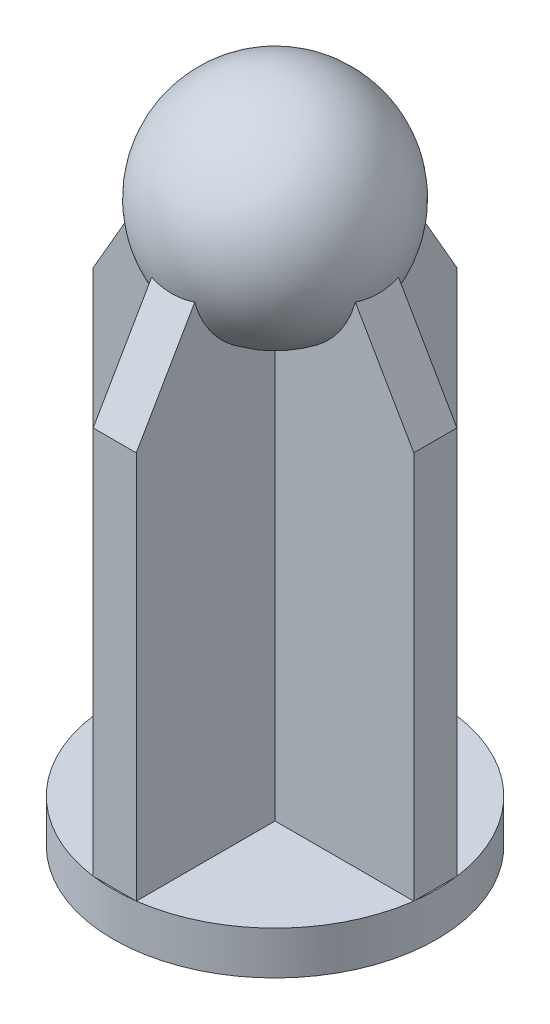
ISO-10303-21;
HEADER;
FILE_DESCRIPTION(('STEP AP214'),'2;1');
FILE_NAME('part.step','',(''),(''),'','','');
FILE_SCHEMA(('AUTOMOTIVE_DESIGN { 1 0 10303 214 1 1 1 1 }'));
ENDSEC;
DATA;
#1=APPLICATION_CONTEXT('core data for automotive mechanical design processes');
#2=APPLICATION_PROTOCOL_DEFINITION('international standard','automotive_design',2000,#1);
#3=PRODUCT_CONTEXT('',#1,'mechanical');
#4=PRODUCT('Part','Part','',(#3));
#5=PRODUCT_RELATED_PRODUCT_CATEGORY('part','',(#4));
#6=PRODUCT_DEFINITION_FORMATION('','',#4);
#7=PRODUCT_DEFINITION_CONTEXT('part definition',#1,'design');
#8=PRODUCT_DEFINITION('design','',#6,#7);
#9=PRODUCT_DEFINITION_SHAPE('','',#8);
#10=(LENGTH_UNIT() NAMED_UNIT(*) SI_UNIT(.MILLI.,.METRE.));
#11=(NAMED_UNIT(*) PLANE_ANGLE_UNIT() SI_UNIT($,.RADIAN.));
#12=(NAMED_UNIT(*) SI_UNIT($,.STERADIAN.) SOLID_ANGLE_UNIT());
#13=UNCERTAINTY_MEASURE_WITH_UNIT(LENGTH_MEASURE(1.E-05),#10,'distance_accuracy_value','');
#14=(GEOMETRIC_REPRESENTATION_CONTEXT(3) GLOBAL_UNCERTAINTY_ASSIGNED_CONTEXT((#13)) GLOBAL_UNIT_ASSIGNED_CONTEXT((#10,
#11,#12)) REPRESENTATION_CONTEXT('',''));
#15=CARTESIAN_POINT('',(0.,0.,0.));
#16=DIRECTION('',(0.,0.,1.));
#17=DIRECTION('',(1.,0.,0.));
#18=AXIS2_PLACEMENT_3D('',#15,#16,#17);
#19=CARTESIAN_POINT('',(0.,10.,0.));
#20=DIRECTION('',(0.,1.,0.));
#21=DIRECTION('',(0.,0.,1.));
#22=AXIS2_PLACEMENT_3D('',#19,#20,#21);
#23=PLANE('',#22);
#24=DIRECTION('',(-1.,0.,0.));
#25=VECTOR('',#24,1.);
#26=CARTESIAN_POINT('',(-5.,10.,-4.99999999999999));
#27=LINE('',#26,#25);
#28=CARTESIAN_POINT('',(-5.,10.,-4.99999999999999));
#29=VERTEX_POINT('',#28);
#30=CARTESIAN_POINT('',(-37.1651718682963,10.,-4.99999999999996));
#31=VERTEX_POINT('',#30);
#32=EDGE_CURVE('E247',#29,#31,#27,.T.);
#33=ORIENTED_EDGE('',*,*,#32,.F.);
#34=DIRECTION('',(0.,0.,1.));
#35=VECTOR('',#34,1.);
#36=CARTESIAN_POINT('',(-5.,10.,-4.99999999999999));
#37=LINE('',#36,#35);
#38=CARTESIAN_POINT('',(-5.00000000000003,10.,-37.1651718682962));
#39=VERTEX_POINT('',#38);
#40=EDGE_CURVE('E286',#39,#29,#37,.T.);
#41=ORIENTED_EDGE('',*,*,#40,.F.);
#42=CARTESIAN_POINT('',(0.,10.,0.));
#43=DIRECTION('',(0.,1.,0.));
#44=DIRECTION('',(0.,0.,1.));
#45=AXIS2_PLACEMENT_3D('',#42,#43,#44);
#46=CIRCLE('',#45,37.5);
#47=EDGE_CURVE('E341',#39,#31,#46,.T.);
#48=ORIENTED_EDGE('',*,*,#47,.T.);
#49=EDGE_LOOP('',(#33,#41,#48));
#50=FACE_BOUND('',#49,.T.);
#51=ADVANCED_FACE('F35',(#50),#23,.T.);
#52=DIRECTION('',(-1.,0.,0.));
#53=VECTOR('',#52,1.);
#54=CARTESIAN_POINT('',(-5.,10.,-37.1651718682962));
#55=LINE('',#54,#53);
#56=CARTESIAN_POINT('',(5.,10.,-37.1651718682962));
#57=VERTEX_POINT('',#56);
#58=EDGE_CURVE('E283',#57,#39,#55,.T.);
#59=ORIENTED_EDGE('',*,*,#58,.F.);
#60=EDGE_CURVE('E318',#57,#39,#46,.T.);
#61=ORIENTED_EDGE('',*,*,#60,.T.);
#62=EDGE_LOOP('',(#59,#61));
#63=FACE_BOUND('',#62,.T.);
#64=ADVANCED_FACE('F346',(#63),#23,.T.);
#65=DIRECTION('',(0.,0.,-1.));
#66=VECTOR('',#65,1.);
#67=CARTESIAN_POINT('',(5.00000000000001,10.,-5.00000000000002));
#68=LINE('',#67,#66);
#69=CARTESIAN_POINT('',(5.00000000000001,10.,-5.00000000000002));
#70=VERTEX_POINT('',#69);
#71=EDGE_CURVE('E280',#70,#57,#68,.T.);
#72=ORIENTED_EDGE('',*,*,#71,.F.);
#73=DIRECTION('',(-1.,0.,0.));
#74=VECTOR('',#73,1.);
#75=CARTESIAN_POINT('',(5.00000000000001,10.,-5.00000000000002));
#76=LINE('',#75,#74);
#77=CARTESIAN_POINT('',(37.1651718682963,10.,-4.99999999999996));
#78=VERTEX_POINT('',#77);
#79=EDGE_CURVE('E277',#78,#70,#76,.T.);
#80=ORIENTED_EDGE('',*,*,#79,.F.);
#81=EDGE_CURVE('E308',#78,#57,#46,.T.);
#82=ORIENTED_EDGE('',*,*,#81,.T.);
#83=EDGE_LOOP('',(#72,#80,#82));
#84=FACE_BOUND('',#83,.T.);
#85=ADVANCED_FACE('F307',(#84),#23,.T.);
#86=DIRECTION('',(0.,0.,-1.));
#87=VECTOR('',#86,1.);
#88=CARTESIAN_POINT('',(37.1651718682963,10.,-5.));
#89=LINE('',#88,#87);
#90=CARTESIAN_POINT('',(37.1651718682962,10.,5.));
#91=VERTEX_POINT('',#90);
#92=EDGE_CURVE('E274',#91,#78,#89,.T.);
#93=ORIENTED_EDGE('',*,*,#92,.F.);
#94=EDGE_CURVE('E202',#91,#78,#46,.T.);
#95=ORIENTED_EDGE('',*,*,#94,.T.);
#96=EDGE_LOOP('',(#93,#95));
#97=FACE_BOUND('',#96,.T.);
#98=ADVANCED_FACE('F321',(#97),#23,.T.);
#99=DIRECTION('',(1.,0.,0.));
#100=VECTOR('',#99,1.);
#101=CARTESIAN_POINT('',(5.00000000000001,10.,5.00000000000002));
#102=LINE('',#101,#100);
#103=CARTESIAN_POINT('',(5.00000000000001,10.,5.00000000000002));
#104=VERTEX_POINT('',#103);
#105=EDGE_CURVE('E272',#104,#91,#102,.T.);
#106=ORIENTED_EDGE('',*,*,#105,.F.);
#107=DIRECTION('',(0.,0.,-1.));
#108=VECTOR('',#107,1.);
#109=CARTESIAN_POINT('',(5.00000000000001,10.,5.00000000000002));
#110=LINE('',#109,#108);
#111=CARTESIAN_POINT('',(5.00000000000003,10.,37.1651718682962));
#112=VERTEX_POINT('',#111);
#113=EDGE_CURVE('E180',#112,#104,#110,.T.);
#114=ORIENTED_EDGE('',*,*,#113,.F.);
#115=EDGE_CURVE('E198',#112,#91,#46,.T.);
#116=ORIENTED_EDGE('',*,*,#115,.T.);
#117=EDGE_LOOP('',(#106,#114,#116));
#118=FACE_BOUND('',#117,.T.);
#119=ADVANCED_FACE('F324',(#118),#23,.T.);
#120=DIRECTION('',(1.,0.,0.));
#121=VECTOR('',#120,1.);
#122=CARTESIAN_POINT('',(-4.99999999999999,10.,37.1651718682962));
#123=LINE('',#122,#121);
#124=CARTESIAN_POINT('',(-4.99999999999999,10.,37.1651718682963));
#125=VERTEX_POINT('',#124);
#126=EDGE_CURVE('E268',#125,#112,#123,.T.);
#127=ORIENTED_EDGE('',*,*,#126,.F.);
#128=EDGE_CURVE('E203',#125,#112,#46,.T.);
#129=ORIENTED_EDGE('',*,*,#128,.T.);
#130=EDGE_LOOP('',(#127,#129));
#131=FACE_BOUND('',#130,.T.);
#132=ADVANCED_FACE('F334',(#131),#23,.T.);
#133=DIRECTION('',(0.,0.,1.));
#134=VECTOR('',#133,1.);
#135=CARTESIAN_POINT('',(-4.99999999999999,10.,4.99999999999999));
#136=LINE('',#135,#134);
#137=CARTESIAN_POINT('',(-4.99999999999999,10.,4.99999999999999));
#138=VERTEX_POINT('',#137);
#139=EDGE_CURVE('E265',#138,#125,#136,.T.);
#140=ORIENTED_EDGE('',*,*,#139,.F.);
#141=DIRECTION('',(1.,0.,0.));
#142=VECTOR('',#141,1.);
#143=CARTESIAN_POINT('',(-4.99999999999999,10.,4.99999999999999));
#144=LINE('',#143,#142);
#145=CARTESIAN_POINT('',(-37.1651718682963,10.,5.));
#146=VERTEX_POINT('',#145);
#147=EDGE_CURVE('E257',#146,#138,#144,.T.);
#148=ORIENTED_EDGE('',*,*,#147,.F.);
#149=EDGE_CURVE('E335',#146,#125,#46,.T.);
#150=ORIENTED_EDGE('',*,*,#149,.T.);
#151=EDGE_LOOP('',(#140,#148,#150));
#152=FACE_BOUND('',#151,.T.);
#153=ADVANCED_FACE('F380',(#152),#23,.T.);
#154=CARTESIAN_POINT('',(0.,10.,0.));
#155=DIRECTION('',(0.,-1.,0.));
#156=DIRECTION('',(0.,0.,-1.));
#157=AXIS2_PLACEMENT_3D('',#154,#155,#156);
#158=CYLINDRICAL_SURFACE('',#157,37.5);
#159=ORIENTED_EDGE('',*,*,#115,.F.);
#160=ORIENTED_EDGE('',*,*,#128,.F.);
#161=ORIENTED_EDGE('',*,*,#149,.F.);
#162=EDGE_CURVE('E336',#31,#146,#46,.T.);
#163=ORIENTED_EDGE('',*,*,#162,.F.);
#164=ORIENTED_EDGE('',*,*,#47,.F.);
#165=ORIENTED_EDGE('',*,*,#60,.F.);
#166=ORIENTED_EDGE('',*,*,#81,.F.);
#167=ORIENTED_EDGE('',*,*,#94,.F.);
#168=EDGE_LOOP('',(#159,#160,#161,#163,#164,#165,#166,#167));
#169=FACE_BOUND('',#168,.T.);
#170=CARTESIAN_POINT('',(0.,0.,0.));
#171=DIRECTION('',(0.,1.,0.));
#172=DIRECTION('',(0.,0.,1.));
#173=AXIS2_PLACEMENT_3D('',#170,#171,#172);
#174=CIRCLE('',#173,37.5);
#175=CARTESIAN_POINT('',(0.,0.,37.5));
#176=VERTEX_POINT('',#175);
#177=EDGE_CURVE('E197',#176,#176,#174,.T.);
#178=ORIENTED_EDGE('',*,*,#177,.T.);
#179=EDGE_LOOP('',(#178));
#180=FACE_BOUND('',#179,.T.);
#181=ADVANCED_FACE('F314',(#169,#180),#158,.T.);
#182=DIRECTION('',(0.,0.,1.));
#183=VECTOR('',#182,1.);
#184=CARTESIAN_POINT('',(-37.1651718682963,10.,-5.));
#185=LINE('',#184,#183);
#186=EDGE_CURVE('E254',#31,#146,#185,.T.);
#187=ORIENTED_EDGE('',*,*,#186,.F.);
#188=ORIENTED_EDGE('',*,*,#162,.T.);
#189=EDGE_LOOP('',(#187,#188));
#190=FACE_BOUND('',#189,.T.);
#191=ADVANCED_FACE('F372',(#190),#23,.T.);
#192=CARTESIAN_POINT('',(0.,0.,0.));
#193=DIRECTION('',(0.,1.,0.));
#194=DIRECTION('',(0.,0.,1.));
#195=AXIS2_PLACEMENT_3D('',#192,#193,#194);
#196=PLANE('',#195);
#197=ORIENTED_EDGE('',*,*,#177,.F.);
#198=EDGE_LOOP('',(#197));
#199=FACE_BOUND('',#198,.T.);
#200=ADVANCED_FACE('F379',(#199),#196,.F.);
#201=CARTESIAN_POINT('',(-5.,130.,-4.99999999999999));
#202=DIRECTION('',(0.,0.,1.));
#203=DIRECTION('',(1.,0.,0.));
#204=AXIS2_PLACEMENT_3D('',#201,#202,#203);
#205=PLANE('',#204);
#206=DIRECTION('',(0.,-1.,0.));
#207=VECTOR('',#206,1.);
#208=CARTESIAN_POINT('',(-37.1651718682963,130.,-5.));
#209=LINE('',#208,#207);
#210=CARTESIAN_POINT('',(-37.1651718682963,99.9999999999999,-5.));
#211=VERTEX_POINT('',#210);
#212=EDGE_CURVE('E195',#211,#31,#209,.T.);
#213=ORIENTED_EDGE('',*,*,#212,.F.);
#214=DIRECTION('',(0.500000000000006,0.866025403784435,0.));
#215=VECTOR('',#214,1.);
#216=CARTESIAN_POINT('',(-19.8446637926072,130.,-5.));
#217=LINE('',#216,#215);
#218=CARTESIAN_POINT('',(-23.6104960285217,123.477387234615,-5.));
#219=VERTEX_POINT('',#218);
#220=EDGE_CURVE('E79',#211,#219,#217,.T.);
#221=ORIENTED_EDGE('',*,*,#220,.T.);
#222=CARTESIAN_POINT('',(0.,130.,-4.99999999999999));
#223=DIRECTION('',(0.,0.,1.));
#224=DIRECTION('',(1.,0.,0.));
#225=AXIS2_PLACEMENT_3D('',#222,#223,#224);
#226=CIRCLE('',#225,24.4948974278318);
#227=CARTESIAN_POINT('',(-5.,106.020842383436,-4.99999999999999));
#228=VERTEX_POINT('',#227);
#229=EDGE_CURVE('E174',#228,#219,#226,.F.);
#230=ORIENTED_EDGE('',*,*,#229,.F.);
#231=DIRECTION('',(0.,-1.,0.));
#232=VECTOR('',#231,1.);
#233=CARTESIAN_POINT('',(-5.,130.,-4.99999999999999));
#234=LINE('',#233,#232);
#235=EDGE_CURVE('E249',#228,#29,#234,.T.);
#236=ORIENTED_EDGE('',*,*,#235,.T.);
#237=ORIENTED_EDGE('',*,*,#32,.T.);
#238=EDGE_LOOP('',(#213,#221,#230,#236,#237));
#239=FACE_BOUND('',#238,.T.);
#240=ADVANCED_FACE('F245',(#239),#205,.F.);
#241=CARTESIAN_POINT('',(-37.1651718682963,130.,-5.));
#242=DIRECTION('',(1.,0.,0.));
#243=DIRECTION('',(0.,0.,-1.));
#244=AXIS2_PLACEMENT_3D('',#241,#242,#243);
#245=PLANE('',#244);
#246=DIRECTION('',(0.,-1.,0.));
#247=VECTOR('',#246,1.);
#248=CARTESIAN_POINT('',(-37.1651718682963,130.,5.));
#249=LINE('',#248,#247);
#250=CARTESIAN_POINT('',(-37.1651718682963,99.9999999999999,5.));
#251=VERTEX_POINT('',#250);
#252=EDGE_CURVE('E193',#251,#146,#249,.T.);
#253=ORIENTED_EDGE('',*,*,#252,.F.);
#254=DIRECTION('',(0.,0.,-1.));
#255=VECTOR('',#254,1.);
#256=CARTESIAN_POINT('',(-37.1651718682963,99.9999999999999,-5.));
#257=LINE('',#256,#255);
#258=EDGE_CURVE('E220',#251,#211,#257,.T.);
#259=ORIENTED_EDGE('',*,*,#258,.T.);
#260=ORIENTED_EDGE('',*,*,#212,.T.);
#261=ORIENTED_EDGE('',*,*,#186,.T.);
#262=EDGE_LOOP('',(#253,#259,#260,#261));
#263=FACE_BOUND('',#262,.T.);
#264=ADVANCED_FACE('F241',(#263),#245,.F.);
#265=CARTESIAN_POINT('',(-4.99999999999999,130.,4.99999999999999));
#266=DIRECTION('',(0.,0.,-1.));
#267=DIRECTION('',(-1.,0.,0.));
#268=AXIS2_PLACEMENT_3D('',#265,#266,#267);
#269=PLANE('',#268);
#270=CARTESIAN_POINT('',(0.,130.,4.99999999999999));
#271=DIRECTION('',(0.,0.,-1.));
#272=DIRECTION('',(-1.,0.,0.));
#273=AXIS2_PLACEMENT_3D('',#270,#271,#272);
#274=CIRCLE('',#273,24.4948974278318);
#275=CARTESIAN_POINT('',(-23.6104960285217,123.477387234615,5.));
#276=VERTEX_POINT('',#275);
#277=CARTESIAN_POINT('',(-4.99999999999999,106.020842383436,4.99999999999999));
#278=VERTEX_POINT('',#277);
#279=EDGE_CURVE('E175',#276,#278,#274,.F.);
#280=ORIENTED_EDGE('',*,*,#279,.F.);
#281=DIRECTION('',(-0.500000000000006,-0.866025403784435,0.));
#282=VECTOR('',#281,1.);
#283=CARTESIAN_POINT('',(-19.8446637926072,130.,5.));
#284=LINE('',#283,#282);
#285=EDGE_CURVE('E218',#276,#251,#284,.T.);
#286=ORIENTED_EDGE('',*,*,#285,.T.);
#287=ORIENTED_EDGE('',*,*,#252,.T.);
#288=ORIENTED_EDGE('',*,*,#147,.T.);
#289=DIRECTION('',(0.,-1.,0.));
#290=VECTOR('',#289,1.);
#291=CARTESIAN_POINT('',(-4.99999999999999,130.,4.99999999999999));
#292=LINE('',#291,#290);
#293=EDGE_CURVE('E191',#278,#138,#292,.T.);
#294=ORIENTED_EDGE('',*,*,#293,.F.);
#295=EDGE_LOOP('',(#280,#286,#287,#288,#294));
#296=FACE_BOUND('',#295,.T.);
#297=ADVANCED_FACE('F235',(#296),#269,.F.);
#298=CARTESIAN_POINT('',(-4.99999999999999,130.,4.99999999999999));
#299=DIRECTION('',(1.,0.,0.));
#300=DIRECTION('',(0.,0.,-1.));
#301=AXIS2_PLACEMENT_3D('',#298,#299,#300);
#302=PLANE('',#301);
#303=DIRECTION('',(0.,-1.,0.));
#304=VECTOR('',#303,1.);
#305=CARTESIAN_POINT('',(-4.99999999999999,130.,37.1651718682962));
#306=LINE('',#305,#304);
#307=CARTESIAN_POINT('',(-4.99999999999999,99.9999999999999,37.1651718682962));
#308=VERTEX_POINT('',#307);
#309=EDGE_CURVE('E184',#308,#125,#306,.T.);
#310=ORIENTED_EDGE('',*,*,#309,.F.);
#311=DIRECTION('',(0.,0.866025403784435,-0.500000000000006));
#312=VECTOR('',#311,1.);
#313=CARTESIAN_POINT('',(-4.99999999999999,130.,19.8446637926072));
#314=LINE('',#313,#312);
#315=CARTESIAN_POINT('',(-4.99999999999999,123.477387234615,23.6104960285217));
#316=VERTEX_POINT('',#315);
#317=EDGE_CURVE('E50',#308,#316,#314,.T.);
#318=ORIENTED_EDGE('',*,*,#317,.T.);
#319=CARTESIAN_POINT('',(-4.99999999999999,130.,0.));
#320=DIRECTION('',(1.,0.,0.));
#321=DIRECTION('',(0.,0.,-1.));
#322=AXIS2_PLACEMENT_3D('',#319,#320,#321);
#323=CIRCLE('',#322,24.4948974278318);
#324=EDGE_CURVE('E165',#278,#316,#323,.F.);
#325=ORIENTED_EDGE('',*,*,#324,.F.);
#326=ORIENTED_EDGE('',*,*,#293,.T.);
#327=ORIENTED_EDGE('',*,*,#139,.T.);
#328=EDGE_LOOP('',(#310,#318,#325,#326,#327));
#329=FACE_BOUND('',#328,.T.);
#330=ADVANCED_FACE('F390',(#329),#302,.F.);
#331=CARTESIAN_POINT('',(-4.99999999999999,130.,37.1651718682962));
#332=DIRECTION('',(0.,0.,-1.));
#333=DIRECTION('',(-1.,0.,0.));
#334=AXIS2_PLACEMENT_3D('',#331,#332,#333);
#335=PLANE('',#334);
#336=DIRECTION('',(0.,-1.,0.));
#337=VECTOR('',#336,1.);
#338=CARTESIAN_POINT('',(5.00000000000001,130.,37.1651718682962));
#339=LINE('',#338,#337);
#340=CARTESIAN_POINT('',(5.00000000000001,99.9999999999999,37.1651718682962));
#341=VERTEX_POINT('',#340);
#342=EDGE_CURVE('E181',#341,#112,#339,.T.);
#343=ORIENTED_EDGE('',*,*,#342,.F.);
#344=DIRECTION('',(-1.,0.,0.));
#345=VECTOR('',#344,1.);
#346=CARTESIAN_POINT('',(-4.99999999999999,99.9999999999999,37.1651718682962));
#347=LINE('',#346,#345);
#348=EDGE_CURVE('E225',#341,#308,#347,.T.);
#349=ORIENTED_EDGE('',*,*,#348,.T.);
#350=ORIENTED_EDGE('',*,*,#309,.T.);
#351=ORIENTED_EDGE('',*,*,#126,.T.);
#352=EDGE_LOOP('',(#343,#349,#350,#351));
#353=FACE_BOUND('',#352,.T.);
#354=ADVANCED_FACE('F332',(#353),#335,.F.);
#355=CARTESIAN_POINT('',(5.00000000000001,130.,5.00000000000002));
#356=DIRECTION('',(-1.,0.,0.));
#357=DIRECTION('',(0.,0.,1.));
#358=AXIS2_PLACEMENT_3D('',#355,#356,#357);
#359=PLANE('',#358);
#360=CARTESIAN_POINT('',(5.,130.,0.));
#361=DIRECTION('',(-1.,0.,0.));
#362=DIRECTION('',(0.,0.,1.));
#363=AXIS2_PLACEMENT_3D('',#360,#361,#362);
#364=CIRCLE('',#363,24.4948974278318);
#365=CARTESIAN_POINT('',(5.00000000000001,123.477387234615,23.6104960285217));
#366=VERTEX_POINT('',#365);
#367=CARTESIAN_POINT('',(5.00000000000001,106.020842383436,5.00000000000002));
#368=VERTEX_POINT('',#367);
#369=EDGE_CURVE('E157',#366,#368,#364,.F.);
#370=ORIENTED_EDGE('',*,*,#369,.F.);
#371=DIRECTION('',(0.,-0.866025403784435,0.500000000000006));
#372=VECTOR('',#371,1.);
#373=CARTESIAN_POINT('',(5.00000000000001,130.,19.8446637926072));
#374=LINE('',#373,#372);
#375=EDGE_CURVE('E223',#366,#341,#374,.T.);
#376=ORIENTED_EDGE('',*,*,#375,.T.);
#377=ORIENTED_EDGE('',*,*,#342,.T.);
#378=ORIENTED_EDGE('',*,*,#113,.T.);
#379=DIRECTION('',(0.,-1.,0.));
#380=VECTOR('',#379,1.);
#381=CARTESIAN_POINT('',(5.00000000000001,130.,5.00000000000002));
#382=LINE('',#381,#380);
#383=EDGE_CURVE('E171',#368,#104,#382,.T.);
#384=ORIENTED_EDGE('',*,*,#383,.F.);
#385=EDGE_LOOP('',(#370,#376,#377,#378,#384));
#386=FACE_BOUND('',#385,.T.);
#387=ADVANCED_FACE('F178',(#386),#359,.F.);
#388=CARTESIAN_POINT('',(5.00000000000001,130.,5.00000000000002));
#389=DIRECTION('',(0.,0.,-1.));
#390=DIRECTION('',(-1.,0.,0.));
#391=AXIS2_PLACEMENT_3D('',#388,#389,#390);
#392=PLANE('',#391);
#393=DIRECTION('',(0.,-1.,0.));
#394=VECTOR('',#393,1.);
#395=CARTESIAN_POINT('',(37.1651718682963,130.,5.));
#396=LINE('',#395,#394);
#397=CARTESIAN_POINT('',(37.1651718682963,99.9999999999999,5.));
#398=VERTEX_POINT('',#397);
#399=EDGE_CURVE('E182',#398,#91,#396,.T.);
#400=ORIENTED_EDGE('',*,*,#399,.F.);
#401=DIRECTION('',(-0.500000000000006,0.866025403784435,0.));
#402=VECTOR('',#401,1.);
#403=CARTESIAN_POINT('',(19.8446637926072,130.,5.00000000000001));
#404=LINE('',#403,#402);
#405=CARTESIAN_POINT('',(23.6104960285217,123.477387234615,5.00000000000001));
#406=VERTEX_POINT('',#405);
#407=EDGE_CURVE('E173',#398,#406,#404,.T.);
#408=ORIENTED_EDGE('',*,*,#407,.T.);
#409=CARTESIAN_POINT('',(0.,130.,5.00000000000002));
#410=DIRECTION('',(0.,0.,-1.));
#411=DIRECTION('',(-1.,0.,0.));
#412=AXIS2_PLACEMENT_3D('',#409,#410,#411);
#413=CIRCLE('',#412,24.4948974278318);
#414=EDGE_CURVE('E160',#368,#406,#413,.F.);
#415=ORIENTED_EDGE('',*,*,#414,.F.);
#416=ORIENTED_EDGE('',*,*,#383,.T.);
#417=ORIENTED_EDGE('',*,*,#105,.T.);
#418=EDGE_LOOP('',(#400,#408,#415,#416,#417));
#419=FACE_BOUND('',#418,.T.);
#420=ADVANCED_FACE('F169',(#419),#392,.F.);
#421=CARTESIAN_POINT('',(37.1651718682963,130.,-5.));
#422=DIRECTION('',(-1.,0.,0.));
#423=DIRECTION('',(0.,0.,1.));
#424=AXIS2_PLACEMENT_3D('',#421,#422,#423);
#425=PLANE('',#424);
#426=DIRECTION('',(0.,-1.,0.));
#427=VECTOR('',#426,1.);
#428=CARTESIAN_POINT('',(37.1651718682963,130.,-5.));
#429=LINE('',#428,#427);
#430=CARTESIAN_POINT('',(37.1651718682963,99.9999999999999,-5.));
#431=VERTEX_POINT('',#430);
#432=EDGE_CURVE('E186',#431,#78,#429,.T.);
#433=ORIENTED_EDGE('',*,*,#432,.F.);
#434=DIRECTION('',(0.,0.,1.));
#435=VECTOR('',#434,1.);
#436=CARTESIAN_POINT('',(37.1651718682963,99.9999999999999,5.));
#437=LINE('',#436,#435);
#438=EDGE_CURVE('E207',#431,#398,#437,.T.);
#439=ORIENTED_EDGE('',*,*,#438,.T.);
#440=ORIENTED_EDGE('',*,*,#399,.T.);
#441=ORIENTED_EDGE('',*,*,#92,.T.);
#442=EDGE_LOOP('',(#433,#439,#440,#441));
#443=FACE_BOUND('',#442,.T.);
#444=ADVANCED_FACE('F322',(#443),#425,.F.);
#445=CARTESIAN_POINT('',(5.00000000000001,130.,-5.00000000000002));
#446=DIRECTION('',(0.,0.,1.));
#447=DIRECTION('',(1.,0.,0.));
#448=AXIS2_PLACEMENT_3D('',#445,#446,#447);
#449=PLANE('',#448);
#450=CARTESIAN_POINT('',(0.,130.,-5.00000000000002));
#451=DIRECTION('',(0.,0.,1.));
#452=DIRECTION('',(1.,0.,0.));
#453=AXIS2_PLACEMENT_3D('',#450,#451,#452);
#454=CIRCLE('',#453,24.4948974278318);
#455=CARTESIAN_POINT('',(23.6104960285217,123.477387234615,-5.00000000000001));
#456=VERTEX_POINT('',#455);
#457=CARTESIAN_POINT('',(5.00000000000001,106.020842383436,-5.00000000000002));
#458=VERTEX_POINT('',#457);
#459=EDGE_CURVE('E260',#456,#458,#454,.F.);
#460=ORIENTED_EDGE('',*,*,#459,.F.);
#461=DIRECTION('',(0.500000000000006,-0.866025403784435,0.));
#462=VECTOR('',#461,1.);
#463=CARTESIAN_POINT('',(19.8446637926072,130.,-5.00000000000001));
#464=LINE('',#463,#462);
#465=EDGE_CURVE('E201',#456,#431,#464,.T.);
#466=ORIENTED_EDGE('',*,*,#465,.T.);
#467=ORIENTED_EDGE('',*,*,#432,.T.);
#468=ORIENTED_EDGE('',*,*,#79,.T.);
#469=DIRECTION('',(0.,-1.,0.));
#470=VECTOR('',#469,1.);
#471=CARTESIAN_POINT('',(5.00000000000001,130.,-5.00000000000002));
#472=LINE('',#471,#470);
#473=EDGE_CURVE('E293',#458,#70,#472,.T.);
#474=ORIENTED_EDGE('',*,*,#473,.F.);
#475=EDGE_LOOP('',(#460,#466,#467,#468,#474));
#476=FACE_BOUND('',#475,.T.);
#477=ADVANCED_FACE('F298',(#476),#449,.F.);
#478=CARTESIAN_POINT('',(5.00000000000001,130.,-5.00000000000002));
#479=DIRECTION('',(-1.,0.,0.));
#480=DIRECTION('',(0.,0.,1.));
#481=AXIS2_PLACEMENT_3D('',#478,#479,#480);
#482=PLANE('',#481);
#483=DIRECTION('',(0.,-1.,0.));
#484=VECTOR('',#483,1.);
#485=CARTESIAN_POINT('',(5.,130.,-37.1651718682962));
#486=LINE('',#485,#484);
#487=CARTESIAN_POINT('',(5.,99.9999999999999,-37.1651718682962));
#488=VERTEX_POINT('',#487);
#489=EDGE_CURVE('E291',#488,#57,#486,.T.);
#490=ORIENTED_EDGE('',*,*,#489,.F.);
#491=DIRECTION('',(0.,0.866025403784435,0.500000000000006));
#492=VECTOR('',#491,1.);
#493=CARTESIAN_POINT('',(5.00000000000001,130.,-19.8446637926072));
#494=LINE('',#493,#492);
#495=CARTESIAN_POINT('',(5.00000000000001,123.477387234615,-23.6104960285217));
#496=VERTEX_POINT('',#495);
#497=EDGE_CURVE('E216',#488,#496,#494,.T.);
#498=ORIENTED_EDGE('',*,*,#497,.T.);
#499=CARTESIAN_POINT('',(5.00000000000001,130.,0.));
#500=DIRECTION('',(-1.,0.,0.));
#501=DIRECTION('',(0.,0.,1.));
#502=AXIS2_PLACEMENT_3D('',#499,#500,#501);
#503=CIRCLE('',#502,24.4948974278318);
#504=EDGE_CURVE('E255',#458,#496,#503,.F.);
#505=ORIENTED_EDGE('',*,*,#504,.F.);
#506=ORIENTED_EDGE('',*,*,#473,.T.);
#507=ORIENTED_EDGE('',*,*,#71,.T.);
#508=EDGE_LOOP('',(#490,#498,#505,#506,#507));
#509=FACE_BOUND('',#508,.T.);
#510=ADVANCED_FACE('F353',(#509),#482,.F.);
#511=CARTESIAN_POINT('',(-5.,130.,-37.1651718682962));
#512=DIRECTION('',(0.,0.,1.));
#513=DIRECTION('',(1.,0.,0.));
#514=AXIS2_PLACEMENT_3D('',#511,#512,#513);
#515=PLANE('',#514);
#516=DIRECTION('',(0.,-1.,0.));
#517=VECTOR('',#516,1.);
#518=CARTESIAN_POINT('',(-5.,130.,-37.1651718682962));
#519=LINE('',#518,#517);
#520=CARTESIAN_POINT('',(-5.,99.9999999999999,-37.1651718682962));
#521=VERTEX_POINT('',#520);
#522=EDGE_CURVE('E289',#521,#39,#519,.T.);
#523=ORIENTED_EDGE('',*,*,#522,.F.);
#524=DIRECTION('',(1.,0.,0.));
#525=VECTOR('',#524,1.);
#526=CARTESIAN_POINT('',(5.,99.9999999999999,-37.1651718682962));
#527=LINE('',#526,#525);
#528=EDGE_CURVE('E213',#521,#488,#527,.T.);
#529=ORIENTED_EDGE('',*,*,#528,.T.);
#530=ORIENTED_EDGE('',*,*,#489,.T.);
#531=ORIENTED_EDGE('',*,*,#58,.T.);
#532=EDGE_LOOP('',(#523,#529,#530,#531));
#533=FACE_BOUND('',#532,.T.);
#534=ADVANCED_FACE('F349',(#533),#515,.F.);
#535=CARTESIAN_POINT('',(-5.,130.,-4.99999999999999));
#536=DIRECTION('',(1.,0.,0.));
#537=DIRECTION('',(0.,0.,-1.));
#538=AXIS2_PLACEMENT_3D('',#535,#536,#537);
#539=PLANE('',#538);
#540=CARTESIAN_POINT('',(-5.,130.,0.));
#541=DIRECTION('',(1.,0.,0.));
#542=DIRECTION('',(0.,0.,-1.));
#543=AXIS2_PLACEMENT_3D('',#540,#541,#542);
#544=CIRCLE('',#543,24.4948974278318);
#545=CARTESIAN_POINT('',(-5.,123.477387234615,-23.6104960285217));
#546=VERTEX_POINT('',#545);
#547=EDGE_CURVE('E355',#546,#228,#544,.F.);
#548=ORIENTED_EDGE('',*,*,#547,.F.);
#549=DIRECTION('',(0.,-0.866025403784435,-0.500000000000006));
#550=VECTOR('',#549,1.);
#551=CARTESIAN_POINT('',(-5.,130.,-19.8446637926072));
#552=LINE('',#551,#550);
#553=EDGE_CURVE('E211',#546,#521,#552,.T.);
#554=ORIENTED_EDGE('',*,*,#553,.T.);
#555=ORIENTED_EDGE('',*,*,#522,.T.);
#556=ORIENTED_EDGE('',*,*,#40,.T.);
#557=ORIENTED_EDGE('',*,*,#235,.F.);
#558=EDGE_LOOP('',(#548,#554,#555,#556,#557));
#559=FACE_BOUND('',#558,.T.);
#560=ADVANCED_FACE('F367',(#559),#539,.F.);
#561=CARTESIAN_POINT('',(0.,130.,0.));
#562=DIRECTION('',(0.,0.,-1.));
#563=DIRECTION('',(1.,0.,0.));
#564=AXIS2_PLACEMENT_3D('',#561,#562,#563);
#565=SPHERICAL_SURFACE('',#564,25.);
#566=ORIENTED_EDGE('',*,*,#414,.T.);
#567=CARTESIAN_POINT('',(14.8834978444553,138.59299148698,0.));
#568=DIRECTION('',(0.866025403784435,0.500000000000006,0.));
#569=DIRECTION('',(-0.500000000000006,0.866025403784435,0.));
#570=AXIS2_PLACEMENT_3D('',#567,#568,#569);
#571=CIRCLE('',#570,18.1560455281097);
#572=EDGE_CURVE('E228',#406,#456,#571,.T.);
#573=ORIENTED_EDGE('',*,*,#572,.T.);
#574=ORIENTED_EDGE('',*,*,#459,.T.);
#575=ORIENTED_EDGE('',*,*,#504,.T.);
#576=CARTESIAN_POINT('',(0.,138.59299148698,-14.8834978444553));
#577=DIRECTION('',(0.,0.500000000000006,-0.866025403784435));
#578=DIRECTION('',(0.,0.866025403784435,0.500000000000006));
#579=AXIS2_PLACEMENT_3D('',#576,#577,#578);
#580=CIRCLE('',#579,18.1560455281097);
#581=EDGE_CURVE('E230',#496,#546,#580,.T.);
#582=ORIENTED_EDGE('',*,*,#581,.T.);
#583=ORIENTED_EDGE('',*,*,#547,.T.);
#584=ORIENTED_EDGE('',*,*,#229,.T.);
#585=CARTESIAN_POINT('',(-14.8834978444553,138.59299148698,0.));
#586=DIRECTION('',(-0.866025403784435,0.500000000000006,0.));
#587=DIRECTION('',(-0.500000000000006,-0.866025403784435,0.));
#588=AXIS2_PLACEMENT_3D('',#585,#586,#587);
#589=CIRCLE('',#588,18.1560455281097);
#590=EDGE_CURVE('E43',#219,#276,#589,.T.);
#591=ORIENTED_EDGE('',*,*,#590,.T.);
#592=ORIENTED_EDGE('',*,*,#279,.T.);
#593=ORIENTED_EDGE('',*,*,#324,.T.);
#594=CARTESIAN_POINT('',(0.,138.59299148698,14.8834978444553));
#595=DIRECTION('',(0.,0.500000000000006,0.866025403784435));
#596=DIRECTION('',(0.,-0.866025403784435,0.500000000000006));
#597=AXIS2_PLACEMENT_3D('',#594,#595,#596);
#598=CIRCLE('',#597,18.1560455281097);
#599=EDGE_CURVE('E11',#316,#366,#598,.T.);
#600=ORIENTED_EDGE('',*,*,#599,.T.);
#601=ORIENTED_EDGE('',*,*,#369,.T.);
#602=EDGE_LOOP('',(#566,#573,#574,#575,#582,#583,#584,#591,#592,#593,#600,#601));
#603=FACE_BOUND('',#602,.T.);
#604=ADVANCED_FACE('F159',(#603),#565,.T.);
#605=CARTESIAN_POINT('',(19.8446637926072,130.,0.));
#606=DIRECTION('',(0.866025403784435,0.500000000000006,0.));
#607=DIRECTION('',(0.,0.,1.));
#608=AXIS2_PLACEMENT_3D('',#605,#606,#607);
#609=PLANE('',#608);
#610=ORIENTED_EDGE('',*,*,#407,.F.);
#611=ORIENTED_EDGE('',*,*,#438,.F.);
#612=ORIENTED_EDGE('',*,*,#465,.F.);
#613=ORIENTED_EDGE('',*,*,#572,.F.);
#614=EDGE_LOOP('',(#610,#611,#612,#613));
#615=FACE_BOUND('',#614,.T.);
#616=ADVANCED_FACE('F357',(#615),#609,.T.);
#617=CARTESIAN_POINT('',(0.,130.,-19.8446637926072));
#618=DIRECTION('',(0.,0.500000000000006,-0.866025403784435));
#619=DIRECTION('',(1.,0.,0.));
#620=AXIS2_PLACEMENT_3D('',#617,#618,#619);
#621=PLANE('',#620);
#622=ORIENTED_EDGE('',*,*,#497,.F.);
#623=ORIENTED_EDGE('',*,*,#528,.F.);
#624=ORIENTED_EDGE('',*,*,#553,.F.);
#625=ORIENTED_EDGE('',*,*,#581,.F.);
#626=EDGE_LOOP('',(#622,#623,#624,#625));
#627=FACE_BOUND('',#626,.T.);
#628=ADVANCED_FACE('F359',(#627),#621,.T.);
#629=CARTESIAN_POINT('',(-19.8446637926072,130.,0.));
#630=DIRECTION('',(-0.866025403784435,0.500000000000006,0.));
#631=DIRECTION('',(0.,0.,-1.));
#632=AXIS2_PLACEMENT_3D('',#629,#630,#631);
#633=PLANE('',#632);
#634=ORIENTED_EDGE('',*,*,#220,.F.);
#635=ORIENTED_EDGE('',*,*,#258,.F.);
#636=ORIENTED_EDGE('',*,*,#285,.F.);
#637=ORIENTED_EDGE('',*,*,#590,.F.);
#638=EDGE_LOOP('',(#634,#635,#636,#637));
#639=FACE_BOUND('',#638,.T.);
#640=ADVANCED_FACE('F239',(#639),#633,.T.);
#641=CARTESIAN_POINT('',(0.,130.,19.8446637926072));
#642=DIRECTION('',(0.,0.500000000000006,0.866025403784435));
#643=DIRECTION('',(-1.,0.,0.));
#644=AXIS2_PLACEMENT_3D('',#641,#642,#643);
#645=PLANE('',#644);
#646=ORIENTED_EDGE('',*,*,#317,.F.);
#647=ORIENTED_EDGE('',*,*,#348,.F.);
#648=ORIENTED_EDGE('',*,*,#375,.F.);
#649=ORIENTED_EDGE('',*,*,#599,.F.);
#650=EDGE_LOOP('',(#646,#647,#648,#649));
#651=FACE_BOUND('',#650,.T.);
#652=ADVANCED_FACE('F37',(#651),#645,.T.);
#653=CLOSED_SHELL('',(#51,#64,#85,#98,#119,#132,#153,#181,#191,#200,#240,#264,#297,#330,#354,
#387,#420,#444,#477,#510,#534,#560,#604,#616,#628,#640,#652));
#654=MANIFOLD_SOLID_BREP('B2',#653);
#655=ADVANCED_BREP_SHAPE_REPRESENTATION('',(#18,#654),#14);
#656=SHAPE_DEFINITION_REPRESENTATION(#9,#655);
ENDSEC;
END-ISO-10303-21;
